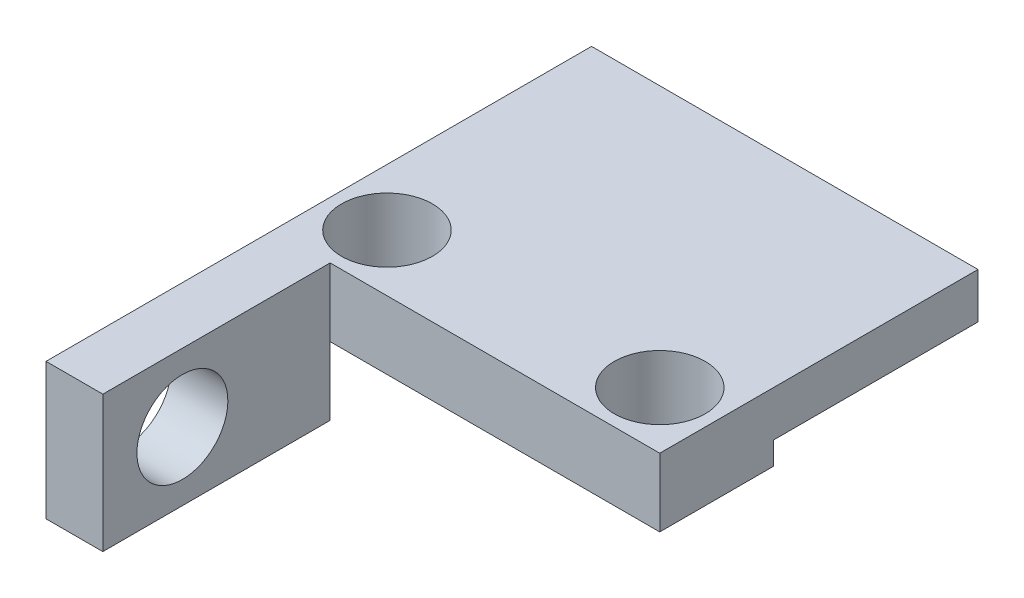
ISO-10303-21;
HEADER;
FILE_DESCRIPTION(('STEP AP214'),'2;1');
FILE_NAME('part.step','',(''),(''),'','','');
FILE_SCHEMA(('AUTOMOTIVE_DESIGN { 1 0 10303 214 1 1 1 1 }'));
ENDSEC;
DATA;
#1=APPLICATION_CONTEXT('core data for automotive mechanical design processes');
#2=APPLICATION_PROTOCOL_DEFINITION('international standard','automotive_design',2000,#1);
#3=PRODUCT_CONTEXT('',#1,'mechanical');
#4=PRODUCT('Part','Part','',(#3));
#5=PRODUCT_RELATED_PRODUCT_CATEGORY('part','',(#4));
#6=PRODUCT_DEFINITION_FORMATION('','',#4);
#7=PRODUCT_DEFINITION_CONTEXT('part definition',#1,'design');
#8=PRODUCT_DEFINITION('design','',#6,#7);
#9=PRODUCT_DEFINITION_SHAPE('','',#8);
#10=(LENGTH_UNIT() NAMED_UNIT(*) SI_UNIT(.MILLI.,.METRE.));
#11=(NAMED_UNIT(*) PLANE_ANGLE_UNIT() SI_UNIT($,.RADIAN.));
#12=(NAMED_UNIT(*) SI_UNIT($,.STERADIAN.) SOLID_ANGLE_UNIT());
#13=UNCERTAINTY_MEASURE_WITH_UNIT(LENGTH_MEASURE(1.E-05),#10,'distance_accuracy_value','');
#14=(GEOMETRIC_REPRESENTATION_CONTEXT(3) GLOBAL_UNCERTAINTY_ASSIGNED_CONTEXT((#13)) GLOBAL_UNIT_ASSIGNED_CONTEXT((#10,
#11,#12)) REPRESENTATION_CONTEXT('',''));
#15=CARTESIAN_POINT('',(0.,0.,0.));
#16=DIRECTION('',(0.,0.,1.));
#17=DIRECTION('',(1.,0.,0.));
#18=AXIS2_PLACEMENT_3D('',#15,#16,#17);
#19=CARTESIAN_POINT('',(19.9712230215827,6.,4.17266187050359));
#20=DIRECTION('',(0.,0.,-1.));
#21=DIRECTION('',(-1.,0.,0.));
#22=AXIS2_PLACEMENT_3D('',#19,#20,#21);
#23=PLANE('',#22);
#24=DIRECTION('',(0.,1.,0.));
#25=VECTOR('',#24,1.);
#26=CARTESIAN_POINT('',(-9.02877697841725,6.,4.1726618705036));
#27=LINE('',#26,#25);
#28=CARTESIAN_POINT('',(-9.02877697841725,0.,4.1726618705036));
#29=VERTEX_POINT('',#28);
#30=CARTESIAN_POINT('',(-9.02877697841725,6.,4.1726618705036));
#31=VERTEX_POINT('',#30);
#32=EDGE_CURVE('E11',#29,#31,#27,.T.);
#33=ORIENTED_EDGE('',*,*,#32,.F.);
#34=DIRECTION('',(1.,0.,0.));
#35=VECTOR('',#34,1.);
#36=CARTESIAN_POINT('',(19.9712230215827,0.,4.17266187050359));
#37=LINE('',#36,#35);
#38=CARTESIAN_POINT('',(19.9712230215827,0.,4.17266187050359));
#39=VERTEX_POINT('',#38);
#40=EDGE_CURVE('E177',#29,#39,#37,.T.);
#41=ORIENTED_EDGE('',*,*,#40,.T.);
#42=DIRECTION('',(0.,-1.,0.));
#43=VECTOR('',#42,1.);
#44=CARTESIAN_POINT('',(19.9712230215827,6.,4.17266187050359));
#45=LINE('',#44,#43);
#46=CARTESIAN_POINT('',(19.9712230215827,6.,4.17266187050359));
#47=VERTEX_POINT('',#46);
#48=EDGE_CURVE('E195',#47,#39,#45,.T.);
#49=ORIENTED_EDGE('',*,*,#48,.F.);
#50=DIRECTION('',(1.,0.,0.));
#51=VECTOR('',#50,1.);
#52=CARTESIAN_POINT('',(19.9712230215827,6.,4.17266187050359));
#53=LINE('',#52,#51);
#54=EDGE_CURVE('E178',#31,#47,#53,.T.);
#55=ORIENTED_EDGE('',*,*,#54,.F.);
#56=EDGE_LOOP('',(#33,#41,#49,#55));
#57=FACE_BOUND('',#56,.T.);
#58=ADVANCED_FACE('F35',(#57),#23,.F.);
#59=CARTESIAN_POINT('',(19.9712230215827,6.,-23.8273381294964));
#60=DIRECTION('',(-1.,0.,0.));
#61=DIRECTION('',(0.,0.,1.));
#62=AXIS2_PLACEMENT_3D('',#59,#60,#61);
#63=PLANE('',#62);
#64=DIRECTION('',(0.,0.,1.));
#65=VECTOR('',#64,1.);
#66=CARTESIAN_POINT('',(19.9712230215827,2.,-23.8273381294964));
#67=LINE('',#66,#65);
#68=CARTESIAN_POINT('',(19.9712230215827,2.,-23.8273381294964));
#69=VERTEX_POINT('',#68);
#70=CARTESIAN_POINT('',(19.9712230215827,2.,-5.8273381294964));
#71=VERTEX_POINT('',#70);
#72=EDGE_CURVE('E175',#69,#71,#67,.T.);
#73=ORIENTED_EDGE('',*,*,#72,.F.);
#74=DIRECTION('',(0.,-1.,0.));
#75=VECTOR('',#74,1.);
#76=CARTESIAN_POINT('',(19.9712230215827,6.,-23.8273381294964));
#77=LINE('',#76,#75);
#78=CARTESIAN_POINT('',(19.9712230215827,6.,-23.8273381294964));
#79=VERTEX_POINT('',#78);
#80=EDGE_CURVE('E192',#79,#69,#77,.T.);
#81=ORIENTED_EDGE('',*,*,#80,.F.);
#82=DIRECTION('',(0.,0.,-1.));
#83=VECTOR('',#82,1.);
#84=CARTESIAN_POINT('',(19.9712230215827,6.,-23.8273381294964));
#85=LINE('',#84,#83);
#86=EDGE_CURVE('E180',#47,#79,#85,.T.);
#87=ORIENTED_EDGE('',*,*,#86,.F.);
#88=ORIENTED_EDGE('',*,*,#48,.T.);
#89=DIRECTION('',(0.,0.,-1.));
#90=VECTOR('',#89,1.);
#91=CARTESIAN_POINT('',(19.9712230215827,0.,-23.8273381294964));
#92=LINE('',#91,#90);
#93=CARTESIAN_POINT('',(19.9712230215827,0.,-5.82733812949641));
#94=VERTEX_POINT('',#93);
#95=EDGE_CURVE('E187',#39,#94,#92,.T.);
#96=ORIENTED_EDGE('',*,*,#95,.T.);
#97=DIRECTION('',(0.,-1.,0.));
#98=VECTOR('',#97,1.);
#99=CARTESIAN_POINT('',(19.9712230215827,6.00000000000001,-5.82733812949641));
#100=LINE('',#99,#98);
#101=EDGE_CURVE('E57',#71,#94,#100,.T.);
#102=ORIENTED_EDGE('',*,*,#101,.F.);
#103=EDGE_LOOP('',(#73,#81,#87,#88,#96,#102));
#104=FACE_BOUND('',#103,.T.);
#105=ADVANCED_FACE('F210',(#104),#63,.F.);
#106=CARTESIAN_POINT('',(-14.0287769784173,6.,-23.8273381294964));
#107=DIRECTION('',(0.,0.,1.));
#108=DIRECTION('',(1.,0.,0.));
#109=AXIS2_PLACEMENT_3D('',#106,#107,#108);
#110=PLANE('',#109);
#111=DIRECTION('',(-1.,0.,0.));
#112=VECTOR('',#111,1.);
#113=CARTESIAN_POINT('',(75.5364999488149,2.,-23.8273381294964));
#114=LINE('',#113,#112);
#115=CARTESIAN_POINT('',(-14.0287769784173,2.,-23.8273381294964));
#116=VERTEX_POINT('',#115);
#117=EDGE_CURVE('E169',#69,#116,#114,.T.);
#118=ORIENTED_EDGE('',*,*,#117,.T.);
#119=DIRECTION('',(0.,-1.,0.));
#120=VECTOR('',#119,1.);
#121=CARTESIAN_POINT('',(-14.0287769784173,6.,-23.8273381294964));
#122=LINE('',#121,#120);
#123=CARTESIAN_POINT('',(-14.0287769784173,6.,-23.8273381294964));
#124=VERTEX_POINT('',#123);
#125=EDGE_CURVE('E120',#124,#116,#122,.T.);
#126=ORIENTED_EDGE('',*,*,#125,.F.);
#127=DIRECTION('',(-1.,0.,0.));
#128=VECTOR('',#127,1.);
#129=CARTESIAN_POINT('',(-14.0287769784173,6.,-23.8273381294964));
#130=LINE('',#129,#128);
#131=EDGE_CURVE('E116',#79,#124,#130,.T.);
#132=ORIENTED_EDGE('',*,*,#131,.F.);
#133=ORIENTED_EDGE('',*,*,#80,.T.);
#134=EDGE_LOOP('',(#118,#126,#132,#133));
#135=FACE_BOUND('',#134,.T.);
#136=ADVANCED_FACE('F206',(#135),#110,.F.);
#137=CARTESIAN_POINT('',(-14.0287769784173,6.,4.1726618705036));
#138=DIRECTION('',(1.,0.,0.));
#139=DIRECTION('',(0.,0.,-1.));
#140=AXIS2_PLACEMENT_3D('',#137,#138,#139);
#141=PLANE('',#140);
#142=CARTESIAN_POINT('',(-14.0287769784173,0.,17.1726618705036));
#143=DIRECTION('',(1.,0.,0.));
#144=DIRECTION('',(0.,0.,-1.));
#145=AXIS2_PLACEMENT_3D('',#142,#143,#144);
#146=CIRCLE('',#145,4.);
#147=CARTESIAN_POINT('',(-14.0287769784173,0.,13.1726618705036));
#148=VERTEX_POINT('',#147);
#149=EDGE_CURVE('E140',#148,#148,#146,.F.);
#150=ORIENTED_EDGE('',*,*,#149,.F.);
#151=EDGE_LOOP('',(#150));
#152=FACE_BOUND('',#151,.T.);
#153=DIRECTION('',(0.,0.,-1.));
#154=VECTOR('',#153,1.);
#155=CARTESIAN_POINT('',(-14.0287769784173,2.,4.1726618705036));
#156=LINE('',#155,#154);
#157=CARTESIAN_POINT('',(-14.0287769784173,2.,-5.8273381294964));
#158=VERTEX_POINT('',#157);
#159=EDGE_CURVE('E38',#158,#116,#156,.T.);
#160=ORIENTED_EDGE('',*,*,#159,.F.);
#161=DIRECTION('',(0.,1.,0.));
#162=VECTOR('',#161,1.);
#163=CARTESIAN_POINT('',(-14.0287769784173,6.,-5.82733812949641));
#164=LINE('',#163,#162);
#165=CARTESIAN_POINT('',(-14.0287769784173,0.,-5.8273381294964));
#166=VERTEX_POINT('',#165);
#167=EDGE_CURVE('E172',#166,#158,#164,.T.);
#168=ORIENTED_EDGE('',*,*,#167,.F.);
#169=DIRECTION('',(0.,0.,1.));
#170=VECTOR('',#169,1.);
#171=CARTESIAN_POINT('',(-14.0287769784173,0.,4.1726618705036));
#172=LINE('',#171,#170);
#173=CARTESIAN_POINT('',(-14.0287769784173,0.,4.1726618705036));
#174=VERTEX_POINT('',#173);
#175=EDGE_CURVE('E181',#166,#174,#172,.T.);
#176=ORIENTED_EDGE('',*,*,#175,.T.);
#177=DIRECTION('',(0.,-1.,0.));
#178=VECTOR('',#177,1.);
#179=CARTESIAN_POINT('',(-14.0287769784173,-6.,4.1726618705036));
#180=LINE('',#179,#178);
#181=CARTESIAN_POINT('',(-14.0287769784173,-6.,4.1726618705036));
#182=VERTEX_POINT('',#181);
#183=EDGE_CURVE('E146',#174,#182,#180,.T.);
#184=ORIENTED_EDGE('',*,*,#183,.T.);
#185=DIRECTION('',(0.,0.,-1.));
#186=VECTOR('',#185,1.);
#187=CARTESIAN_POINT('',(-14.0287769784173,-6.,24.1726618705036));
#188=LINE('',#187,#186);
#189=CARTESIAN_POINT('',(-14.0287769784173,-6.,24.1726618705036));
#190=VERTEX_POINT('',#189);
#191=EDGE_CURVE('E127',#190,#182,#188,.T.);
#192=ORIENTED_EDGE('',*,*,#191,.F.);
#193=DIRECTION('',(0.,-1.,0.));
#194=VECTOR('',#193,1.);
#195=CARTESIAN_POINT('',(-14.0287769784173,-6.,24.1726618705036));
#196=LINE('',#195,#194);
#197=CARTESIAN_POINT('',(-14.0287769784173,6.,24.1726618705036));
#198=VERTEX_POINT('',#197);
#199=EDGE_CURVE('E123',#198,#190,#196,.T.);
#200=ORIENTED_EDGE('',*,*,#199,.F.);
#201=DIRECTION('',(0.,0.,1.));
#202=VECTOR('',#201,1.);
#203=CARTESIAN_POINT('',(-14.0287769784173,6.,4.1726618705036));
#204=LINE('',#203,#202);
#205=EDGE_CURVE('E109',#124,#198,#204,.T.);
#206=ORIENTED_EDGE('',*,*,#205,.F.);
#207=ORIENTED_EDGE('',*,*,#125,.T.);
#208=EDGE_LOOP('',(#160,#168,#176,#184,#192,#200,#206,#207));
#209=FACE_BOUND('',#208,.T.);
#210=ADVANCED_FACE('F125',(#152,#209),#141,.F.);
#211=CARTESIAN_POINT('',(0.,0.,0.));
#212=DIRECTION('',(0.,-1.,0.));
#213=DIRECTION('',(0.,0.,-1.));
#214=AXIS2_PLACEMENT_3D('',#211,#212,#213);
#215=PLANE('',#214);
#216=CARTESIAN_POINT('',(14.9712230215827,0.,-0.827338129496403));
#217=DIRECTION('',(0.,-1.,0.));
#218=DIRECTION('',(0.,0.,-1.));
#219=AXIS2_PLACEMENT_3D('',#216,#217,#218);
#220=CIRCLE('',#219,4.);
#221=CARTESIAN_POINT('',(14.9712230215827,0.,-4.8273381294964));
#222=VERTEX_POINT('',#221);
#223=EDGE_CURVE('E154',#222,#222,#220,.T.);
#224=ORIENTED_EDGE('',*,*,#223,.F.);
#225=EDGE_LOOP('',(#224));
#226=FACE_BOUND('',#225,.T.);
#227=CARTESIAN_POINT('',(-9.02877697841725,0.,-0.827338129496405));
#228=DIRECTION('',(0.,-1.,0.));
#229=DIRECTION('',(0.,0.,-1.));
#230=AXIS2_PLACEMENT_3D('',#227,#228,#229);
#231=CIRCLE('',#230,4.);
#232=CARTESIAN_POINT('',(-9.02877697841725,0.,-4.82733812949641));
#233=VERTEX_POINT('',#232);
#234=EDGE_CURVE('E160',#233,#233,#231,.T.);
#235=ORIENTED_EDGE('',*,*,#234,.F.);
#236=EDGE_LOOP('',(#235));
#237=FACE_BOUND('',#236,.T.);
#238=ORIENTED_EDGE('',*,*,#175,.F.);
#239=DIRECTION('',(1.,0.,0.));
#240=VECTOR('',#239,1.);
#241=CARTESIAN_POINT('',(0.,0.,-5.8273381294964));
#242=LINE('',#241,#240);
#243=EDGE_CURVE('E197',#166,#94,#242,.T.);
#244=ORIENTED_EDGE('',*,*,#243,.T.);
#245=ORIENTED_EDGE('',*,*,#95,.F.);
#246=ORIENTED_EDGE('',*,*,#40,.F.);
#247=EDGE_CURVE('E184',#174,#29,#37,.T.);
#248=ORIENTED_EDGE('',*,*,#247,.F.);
#249=EDGE_LOOP('',(#238,#244,#245,#246,#248));
#250=FACE_BOUND('',#249,.T.);
#251=ADVANCED_FACE('F214',(#226,#237,#250),#215,.T.);
#252=CARTESIAN_POINT('',(0.,6.,0.));
#253=DIRECTION('',(0.,-1.,0.));
#254=DIRECTION('',(0.,0.,-1.));
#255=AXIS2_PLACEMENT_3D('',#252,#253,#254);
#256=PLANE('',#255);
#257=CARTESIAN_POINT('',(14.9712230215827,6.,-0.827338129496403));
#258=DIRECTION('',(0.,-1.,0.));
#259=DIRECTION('',(0.,0.,-1.));
#260=AXIS2_PLACEMENT_3D('',#257,#258,#259);
#261=CIRCLE('',#260,4.);
#262=CARTESIAN_POINT('',(14.9712230215827,6.,-4.8273381294964));
#263=VERTEX_POINT('',#262);
#264=EDGE_CURVE('E157',#263,#263,#261,.F.);
#265=ORIENTED_EDGE('',*,*,#264,.F.);
#266=EDGE_LOOP('',(#265));
#267=FACE_BOUND('',#266,.T.);
#268=CARTESIAN_POINT('',(-9.02877697841725,6.,-0.827338129496405));
#269=DIRECTION('',(0.,-1.,0.));
#270=DIRECTION('',(0.,0.,-1.));
#271=AXIS2_PLACEMENT_3D('',#268,#269,#270);
#272=CIRCLE('',#271,4.);
#273=CARTESIAN_POINT('',(-9.02877697841725,6.,-4.82733812949641));
#274=VERTEX_POINT('',#273);
#275=EDGE_CURVE('E163',#274,#274,#272,.F.);
#276=ORIENTED_EDGE('',*,*,#275,.F.);
#277=EDGE_LOOP('',(#276));
#278=FACE_BOUND('',#277,.T.);
#279=ORIENTED_EDGE('',*,*,#205,.T.);
#280=DIRECTION('',(-1.,0.,0.));
#281=VECTOR('',#280,1.);
#282=CARTESIAN_POINT('',(-14.0287769784173,6.,24.1726618705036));
#283=LINE('',#282,#281);
#284=CARTESIAN_POINT('',(-9.02877697841725,6.,24.1726618705036));
#285=VERTEX_POINT('',#284);
#286=EDGE_CURVE('E114',#285,#198,#283,.T.);
#287=ORIENTED_EDGE('',*,*,#286,.F.);
#288=DIRECTION('',(0.,0.,-1.));
#289=VECTOR('',#288,1.);
#290=CARTESIAN_POINT('',(-9.02877697841725,6.,24.1726618705036));
#291=LINE('',#290,#289);
#292=EDGE_CURVE('E145',#285,#31,#291,.T.);
#293=ORIENTED_EDGE('',*,*,#292,.T.);
#294=ORIENTED_EDGE('',*,*,#54,.T.);
#295=ORIENTED_EDGE('',*,*,#86,.T.);
#296=ORIENTED_EDGE('',*,*,#131,.T.);
#297=EDGE_LOOP('',(#279,#287,#293,#294,#295,#296));
#298=FACE_BOUND('',#297,.T.);
#299=ADVANCED_FACE('F111',(#267,#278,#298),#256,.F.);
#300=CARTESIAN_POINT('',(75.5364999488149,2.,-23.8273381294964));
#301=DIRECTION('',(0.,-1.,0.));
#302=DIRECTION('',(0.,0.,-1.));
#303=AXIS2_PLACEMENT_3D('',#300,#301,#302);
#304=PLANE('',#303);
#305=ORIENTED_EDGE('',*,*,#117,.F.);
#306=ORIENTED_EDGE('',*,*,#72,.T.);
#307=DIRECTION('',(-1.,0.,0.));
#308=VECTOR('',#307,1.);
#309=CARTESIAN_POINT('',(75.5364999488149,2.,-5.8273381294964));
#310=LINE('',#309,#308);
#311=EDGE_CURVE('E166',#71,#158,#310,.T.);
#312=ORIENTED_EDGE('',*,*,#311,.T.);
#313=ORIENTED_EDGE('',*,*,#159,.T.);
#314=EDGE_LOOP('',(#305,#306,#312,#313));
#315=FACE_BOUND('',#314,.T.);
#316=ADVANCED_FACE('F202',(#315),#304,.T.);
#317=CARTESIAN_POINT('',(75.5364999488149,2.,-5.8273381294964));
#318=DIRECTION('',(0.,0.,-1.));
#319=DIRECTION('',(0.,1.,0.));
#320=AXIS2_PLACEMENT_3D('',#317,#318,#319);
#321=PLANE('',#320);
#322=ORIENTED_EDGE('',*,*,#311,.F.);
#323=ORIENTED_EDGE('',*,*,#101,.T.);
#324=ORIENTED_EDGE('',*,*,#243,.F.);
#325=ORIENTED_EDGE('',*,*,#167,.T.);
#326=EDGE_LOOP('',(#322,#323,#324,#325));
#327=FACE_BOUND('',#326,.T.);
#328=ADVANCED_FACE('F212',(#327),#321,.T.);
#329=CARTESIAN_POINT('',(-9.02877697841725,6.001,-0.827338129496405));
#330=DIRECTION('',(0.,-1.,0.));
#331=DIRECTION('',(0.,0.,-1.));
#332=AXIS2_PLACEMENT_3D('',#329,#330,#331);
#333=CYLINDRICAL_SURFACE('',#332,4.);
#334=CARTESIAN_POINT('',(-9.02877697841725,0.,-4.82733812949641));
#335=CARTESIAN_POINT('',(-9.02877697841725,0.0625000000000001,-4.82733812949641));
#336=CARTESIAN_POINT('',(-9.02877697841725,0.125,-4.82733812949641));
#337=CARTESIAN_POINT('',(-9.02877697841725,0.25,-4.82733812949641));
#338=CARTESIAN_POINT('',(-9.02877697841725,0.3125,-4.82733812949641));
#339=CARTESIAN_POINT('',(-9.02877697841725,0.4375,-4.82733812949641));
#340=CARTESIAN_POINT('',(-9.02877697841725,0.5,-4.82733812949641));
#341=CARTESIAN_POINT('',(-9.02877697841725,0.625000000000001,-4.82733812949641));
#342=CARTESIAN_POINT('',(-9.02877697841725,0.687500000000001,-4.82733812949641));
#343=CARTESIAN_POINT('',(-9.02877697841725,0.8125,-4.82733812949641));
#344=CARTESIAN_POINT('',(-9.02877697841725,0.875,-4.82733812949641));
#345=CARTESIAN_POINT('',(-9.02877697841725,1.,-4.82733812949641));
#346=CARTESIAN_POINT('',(-9.02877697841725,1.0625,-4.82733812949641));
#347=CARTESIAN_POINT('',(-9.02877697841725,1.1875,-4.82733812949641));
#348=CARTESIAN_POINT('',(-9.02877697841725,1.25,-4.82733812949641));
#349=CARTESIAN_POINT('',(-9.02877697841725,1.375,-4.82733812949641));
#350=CARTESIAN_POINT('',(-9.02877697841725,1.4375,-4.82733812949641));
#351=CARTESIAN_POINT('',(-9.02877697841725,1.5625,-4.82733812949641));
#352=CARTESIAN_POINT('',(-9.02877697841725,1.625,-4.82733812949641));
#353=CARTESIAN_POINT('',(-9.02877697841725,1.75,-4.82733812949641));
#354=CARTESIAN_POINT('',(-9.02877697841725,1.8125,-4.82733812949641));
#355=CARTESIAN_POINT('',(-9.02877697841725,1.9375,-4.82733812949641));
#356=CARTESIAN_POINT('',(-9.02877697841725,2.,-4.82733812949641));
#357=CARTESIAN_POINT('',(-9.02877697841725,2.125,-4.82733812949641));
#358=CARTESIAN_POINT('',(-9.02877697841725,2.1875,-4.82733812949641));
#359=CARTESIAN_POINT('',(-9.02877697841725,2.3125,-4.82733812949641));
#360=CARTESIAN_POINT('',(-9.02877697841725,2.375,-4.82733812949641));
#361=CARTESIAN_POINT('',(-9.02877697841725,2.5,-4.82733812949641));
#362=CARTESIAN_POINT('',(-9.02877697841725,2.5625,-4.82733812949641));
#363=CARTESIAN_POINT('',(-9.02877697841725,2.6875,-4.82733812949641));
#364=CARTESIAN_POINT('',(-9.02877697841725,2.75,-4.82733812949641));
#365=CARTESIAN_POINT('',(-9.02877697841725,2.875,-4.82733812949641));
#366=CARTESIAN_POINT('',(-9.02877697841725,2.9375,-4.82733812949641));
#367=CARTESIAN_POINT('',(-9.02877697841725,3.0625,-4.82733812949641));
#368=CARTESIAN_POINT('',(-9.02877697841725,3.125,-4.82733812949641));
#369=CARTESIAN_POINT('',(-9.02877697841725,3.25,-4.82733812949641));
#370=CARTESIAN_POINT('',(-9.02877697841725,3.3125,-4.82733812949641));
#371=CARTESIAN_POINT('',(-9.02877697841725,3.4375,-4.82733812949641));
#372=CARTESIAN_POINT('',(-9.02877697841725,3.5,-4.82733812949641));
#373=CARTESIAN_POINT('',(-9.02877697841725,3.625,-4.82733812949641));
#374=CARTESIAN_POINT('',(-9.02877697841725,3.6875,-4.82733812949641));
#375=CARTESIAN_POINT('',(-9.02877697841725,3.8125,-4.82733812949641));
#376=CARTESIAN_POINT('',(-9.02877697841725,3.875,-4.82733812949641));
#377=CARTESIAN_POINT('',(-9.02877697841725,4.,-4.82733812949641));
#378=CARTESIAN_POINT('',(-9.02877697841725,4.0625,-4.82733812949641));
#379=CARTESIAN_POINT('',(-9.02877697841725,4.1875,-4.82733812949641));
#380=CARTESIAN_POINT('',(-9.02877697841725,4.25,-4.82733812949641));
#381=CARTESIAN_POINT('',(-9.02877697841725,4.375,-4.82733812949641));
#382=CARTESIAN_POINT('',(-9.02877697841725,4.4375,-4.82733812949641));
#383=CARTESIAN_POINT('',(-9.02877697841725,4.5625,-4.82733812949641));
#384=CARTESIAN_POINT('',(-9.02877697841725,4.625,-4.82733812949641));
#385=CARTESIAN_POINT('',(-9.02877697841725,4.75,-4.82733812949641));
#386=CARTESIAN_POINT('',(-9.02877697841725,4.8125,-4.82733812949641));
#387=CARTESIAN_POINT('',(-9.02877697841725,4.9375,-4.82733812949641));
#388=CARTESIAN_POINT('',(-9.02877697841725,5.,-4.82733812949641));
#389=CARTESIAN_POINT('',(-9.02877697841725,5.125,-4.82733812949641));
#390=CARTESIAN_POINT('',(-9.02877697841725,5.1875,-4.82733812949641));
#391=CARTESIAN_POINT('',(-9.02877697841725,5.3125,-4.82733812949641));
#392=CARTESIAN_POINT('',(-9.02877697841725,5.375,-4.82733812949641));
#393=CARTESIAN_POINT('',(-9.02877697841725,5.5,-4.82733812949641));
#394=CARTESIAN_POINT('',(-9.02877697841725,5.5625,-4.82733812949641));
#395=CARTESIAN_POINT('',(-9.02877697841725,5.6875,-4.82733812949641));
#396=CARTESIAN_POINT('',(-9.02877697841725,5.75,-4.82733812949641));
#397=CARTESIAN_POINT('',(-9.02877697841725,5.875,-4.82733812949641));
#398=CARTESIAN_POINT('',(-9.02877697841725,5.9375,-4.82733812949641));
#399=CARTESIAN_POINT('',(-9.02877697841725,6.,-4.82733812949641));
#400=B_SPLINE_CURVE_WITH_KNOTS('',3,(#334,#335,#336,#337,#338,#339,#340,#341,#342,#343,#344,
#345,#346,#347,#348,#349,#350,#351,#352,#353,#354,#355,#356,#357,#358,#359,#360,#361,#362,#363,
#364,#365,#366,#367,#368,#369,#370,#371,#372,#373,#374,#375,#376,#377,#378,#379,#380,#381,#382,
#383,#384,#385,#386,#387,#388,#389,#390,#391,#392,#393,#394,#395,#396,#397,#398,#399),
.UNSPECIFIED.,.F.,.F.,(4,2,2,2,2,2,2,2,2,2,2,2,2,2,2,2,2,2,2,2,2,2,2,2,2,2,2,2,2,2,2,2,4),(0.,
0.1875,0.375,0.5625,0.750000000000001,0.9375,1.125,1.3125,1.5,1.6875,1.875,2.0625,2.25,2.4375,
2.625,2.8125,3.,3.1875,3.375,3.5625,3.75,3.9375,4.125,4.3125,4.5,4.6875,4.875,5.0625,5.25,
5.4375,5.625,5.8125,6.),.UNSPECIFIED.);
#401=EDGE_CURVE('BSEAM247',#233,#274,#400,.T.);
#402=ORIENTED_EDGE('',*,*,#234,.T.);
#403=ORIENTED_EDGE('',*,*,#275,.T.);
#404=ORIENTED_EDGE('',*,*,#401,.T.);
#405=ORIENTED_EDGE('',*,*,#401,.F.);
#406=EDGE_LOOP('',(#402,#404,#403,#405));
#407=FACE_BOUND('',#406,.T.);
#408=ADVANCED_FACE('F247',(#407),#333,.F.);
#409=CARTESIAN_POINT('',(14.9712230215827,6.001,-0.827338129496403));
#410=DIRECTION('',(0.,-1.,0.));
#411=DIRECTION('',(0.,0.,-1.));
#412=AXIS2_PLACEMENT_3D('',#409,#410,#411);
#413=CYLINDRICAL_SURFACE('',#412,4.);
#414=CARTESIAN_POINT('',(14.9712230215827,0.,-4.8273381294964));
#415=CARTESIAN_POINT('',(14.9712230215827,0.0625000000000001,-4.8273381294964));
#416=CARTESIAN_POINT('',(14.9712230215827,0.125,-4.8273381294964));
#417=CARTESIAN_POINT('',(14.9712230215827,0.25,-4.8273381294964));
#418=CARTESIAN_POINT('',(14.9712230215827,0.3125,-4.8273381294964));
#419=CARTESIAN_POINT('',(14.9712230215827,0.4375,-4.8273381294964));
#420=CARTESIAN_POINT('',(14.9712230215827,0.5,-4.8273381294964));
#421=CARTESIAN_POINT('',(14.9712230215827,0.625000000000001,-4.8273381294964));
#422=CARTESIAN_POINT('',(14.9712230215827,0.687500000000001,-4.8273381294964));
#423=CARTESIAN_POINT('',(14.9712230215827,0.8125,-4.8273381294964));
#424=CARTESIAN_POINT('',(14.9712230215827,0.875,-4.8273381294964));
#425=CARTESIAN_POINT('',(14.9712230215827,1.,-4.8273381294964));
#426=CARTESIAN_POINT('',(14.9712230215827,1.0625,-4.8273381294964));
#427=CARTESIAN_POINT('',(14.9712230215827,1.1875,-4.8273381294964));
#428=CARTESIAN_POINT('',(14.9712230215827,1.25,-4.8273381294964));
#429=CARTESIAN_POINT('',(14.9712230215827,1.375,-4.8273381294964));
#430=CARTESIAN_POINT('',(14.9712230215827,1.4375,-4.8273381294964));
#431=CARTESIAN_POINT('',(14.9712230215827,1.5625,-4.8273381294964));
#432=CARTESIAN_POINT('',(14.9712230215827,1.625,-4.8273381294964));
#433=CARTESIAN_POINT('',(14.9712230215827,1.75,-4.8273381294964));
#434=CARTESIAN_POINT('',(14.9712230215827,1.8125,-4.8273381294964));
#435=CARTESIAN_POINT('',(14.9712230215827,1.9375,-4.8273381294964));
#436=CARTESIAN_POINT('',(14.9712230215827,2.,-4.8273381294964));
#437=CARTESIAN_POINT('',(14.9712230215827,2.125,-4.8273381294964));
#438=CARTESIAN_POINT('',(14.9712230215827,2.1875,-4.8273381294964));
#439=CARTESIAN_POINT('',(14.9712230215827,2.3125,-4.8273381294964));
#440=CARTESIAN_POINT('',(14.9712230215827,2.375,-4.8273381294964));
#441=CARTESIAN_POINT('',(14.9712230215827,2.5,-4.8273381294964));
#442=CARTESIAN_POINT('',(14.9712230215827,2.5625,-4.8273381294964));
#443=CARTESIAN_POINT('',(14.9712230215827,2.6875,-4.8273381294964));
#444=CARTESIAN_POINT('',(14.9712230215827,2.75,-4.8273381294964));
#445=CARTESIAN_POINT('',(14.9712230215827,2.875,-4.8273381294964));
#446=CARTESIAN_POINT('',(14.9712230215827,2.9375,-4.8273381294964));
#447=CARTESIAN_POINT('',(14.9712230215827,3.0625,-4.8273381294964));
#448=CARTESIAN_POINT('',(14.9712230215827,3.125,-4.8273381294964));
#449=CARTESIAN_POINT('',(14.9712230215827,3.25,-4.8273381294964));
#450=CARTESIAN_POINT('',(14.9712230215827,3.3125,-4.8273381294964));
#451=CARTESIAN_POINT('',(14.9712230215827,3.4375,-4.8273381294964));
#452=CARTESIAN_POINT('',(14.9712230215827,3.5,-4.8273381294964));
#453=CARTESIAN_POINT('',(14.9712230215827,3.625,-4.8273381294964));
#454=CARTESIAN_POINT('',(14.9712230215827,3.6875,-4.8273381294964));
#455=CARTESIAN_POINT('',(14.9712230215827,3.8125,-4.8273381294964));
#456=CARTESIAN_POINT('',(14.9712230215827,3.875,-4.8273381294964));
#457=CARTESIAN_POINT('',(14.9712230215827,4.,-4.8273381294964));
#458=CARTESIAN_POINT('',(14.9712230215827,4.0625,-4.8273381294964));
#459=CARTESIAN_POINT('',(14.9712230215827,4.1875,-4.8273381294964));
#460=CARTESIAN_POINT('',(14.9712230215827,4.25,-4.8273381294964));
#461=CARTESIAN_POINT('',(14.9712230215827,4.375,-4.8273381294964));
#462=CARTESIAN_POINT('',(14.9712230215827,4.4375,-4.8273381294964));
#463=CARTESIAN_POINT('',(14.9712230215827,4.5625,-4.8273381294964));
#464=CARTESIAN_POINT('',(14.9712230215827,4.625,-4.8273381294964));
#465=CARTESIAN_POINT('',(14.9712230215827,4.75,-4.8273381294964));
#466=CARTESIAN_POINT('',(14.9712230215827,4.8125,-4.8273381294964));
#467=CARTESIAN_POINT('',(14.9712230215827,4.9375,-4.8273381294964));
#468=CARTESIAN_POINT('',(14.9712230215827,5.,-4.8273381294964));
#469=CARTESIAN_POINT('',(14.9712230215827,5.125,-4.8273381294964));
#470=CARTESIAN_POINT('',(14.9712230215827,5.1875,-4.8273381294964));
#471=CARTESIAN_POINT('',(14.9712230215827,5.3125,-4.8273381294964));
#472=CARTESIAN_POINT('',(14.9712230215827,5.375,-4.8273381294964));
#473=CARTESIAN_POINT('',(14.9712230215827,5.5,-4.8273381294964));
#474=CARTESIAN_POINT('',(14.9712230215827,5.5625,-4.8273381294964));
#475=CARTESIAN_POINT('',(14.9712230215827,5.6875,-4.8273381294964));
#476=CARTESIAN_POINT('',(14.9712230215827,5.75,-4.8273381294964));
#477=CARTESIAN_POINT('',(14.9712230215827,5.875,-4.8273381294964));
#478=CARTESIAN_POINT('',(14.9712230215827,5.9375,-4.8273381294964));
#479=CARTESIAN_POINT('',(14.9712230215827,6.,-4.8273381294964));
#480=B_SPLINE_CURVE_WITH_KNOTS('',3,(#414,#415,#416,#417,#418,#419,#420,#421,#422,#423,#424,
#425,#426,#427,#428,#429,#430,#431,#432,#433,#434,#435,#436,#437,#438,#439,#440,#441,#442,#443,
#444,#445,#446,#447,#448,#449,#450,#451,#452,#453,#454,#455,#456,#457,#458,#459,#460,#461,#462,
#463,#464,#465,#466,#467,#468,#469,#470,#471,#472,#473,#474,#475,#476,#477,#478,#479),
.UNSPECIFIED.,.F.,.F.,(4,2,2,2,2,2,2,2,2,2,2,2,2,2,2,2,2,2,2,2,2,2,2,2,2,2,2,2,2,2,2,2,4),(0.,
0.1875,0.375,0.5625,0.750000000000001,0.9375,1.125,1.3125,1.5,1.6875,1.875,2.0625,2.25,2.4375,
2.625,2.8125,3.,3.1875,3.375,3.5625,3.75,3.9375,4.125,4.3125,4.5,4.6875,4.875,5.0625,5.25,
5.4375,5.625,5.8125,6.),.UNSPECIFIED.);
#481=EDGE_CURVE('BSEAM250',#222,#263,#480,.T.);
#482=ORIENTED_EDGE('',*,*,#223,.T.);
#483=ORIENTED_EDGE('',*,*,#264,.T.);
#484=ORIENTED_EDGE('',*,*,#481,.T.);
#485=ORIENTED_EDGE('',*,*,#481,.F.);
#486=EDGE_LOOP('',(#482,#484,#483,#485));
#487=FACE_BOUND('',#486,.T.);
#488=ADVANCED_FACE('F250',(#487),#413,.F.);
#489=CARTESIAN_POINT('',(-9.02877697841725,-6.,24.1726618705036));
#490=DIRECTION('',(0.,1.,0.));
#491=DIRECTION('',(-1.,0.,0.));
#492=AXIS2_PLACEMENT_3D('',#489,#490,#491);
#493=PLANE('',#492);
#494=DIRECTION('',(1.,0.,0.));
#495=VECTOR('',#494,1.);
#496=CARTESIAN_POINT('',(-9.02877697841725,-6.,4.1726618705036));
#497=LINE('',#496,#495);
#498=CARTESIAN_POINT('',(-9.02877697841725,-6.,4.1726618705036));
#499=VERTEX_POINT('',#498);
#500=EDGE_CURVE('E138',#182,#499,#497,.T.);
#501=ORIENTED_EDGE('',*,*,#500,.T.);
#502=DIRECTION('',(0.,0.,-1.));
#503=VECTOR('',#502,1.);
#504=CARTESIAN_POINT('',(-9.02877697841725,-6.,24.1726618705036));
#505=LINE('',#504,#503);
#506=CARTESIAN_POINT('',(-9.02877697841725,-6.,24.1726618705036));
#507=VERTEX_POINT('',#506);
#508=EDGE_CURVE('E150',#507,#499,#505,.T.);
#509=ORIENTED_EDGE('',*,*,#508,.F.);
#510=DIRECTION('',(1.,0.,0.));
#511=VECTOR('',#510,1.);
#512=CARTESIAN_POINT('',(-9.02877697841725,-6.,24.1726618705036));
#513=LINE('',#512,#511);
#514=EDGE_CURVE('E130',#190,#507,#513,.T.);
#515=ORIENTED_EDGE('',*,*,#514,.F.);
#516=ORIENTED_EDGE('',*,*,#191,.T.);
#517=EDGE_LOOP('',(#501,#509,#515,#516));
#518=FACE_BOUND('',#517,.T.);
#519=ADVANCED_FACE('F221',(#518),#493,.F.);
#520=CARTESIAN_POINT('',(-9.02877697841725,6.,24.1726618705036));
#521=DIRECTION('',(-1.,0.,0.));
#522=DIRECTION('',(0.,-1.,0.));
#523=AXIS2_PLACEMENT_3D('',#520,#521,#522);
#524=PLANE('',#523);
#525=CARTESIAN_POINT('',(-9.02877697841725,0.,17.1726618705036));
#526=DIRECTION('',(1.,0.,0.));
#527=DIRECTION('',(0.,1.,0.));
#528=AXIS2_PLACEMENT_3D('',#525,#526,#527);
#529=CIRCLE('',#528,4.);
#530=CARTESIAN_POINT('',(-9.02877697841725,4.,17.1726618705036));
#531=VERTEX_POINT('',#530);
#532=EDGE_CURVE('E272',#531,#531,#529,.T.);
#533=ORIENTED_EDGE('',*,*,#532,.F.);
#534=EDGE_LOOP('',(#533));
#535=FACE_BOUND('',#534,.T.);
#536=EDGE_CURVE('E44',#499,#29,#27,.T.);
#537=ORIENTED_EDGE('',*,*,#536,.T.);
#538=ORIENTED_EDGE('',*,*,#32,.T.);
#539=ORIENTED_EDGE('',*,*,#292,.F.);
#540=DIRECTION('',(0.,1.,0.));
#541=VECTOR('',#540,1.);
#542=CARTESIAN_POINT('',(-9.02877697841725,6.,24.1726618705036));
#543=LINE('',#542,#541);
#544=EDGE_CURVE('E134',#507,#285,#543,.T.);
#545=ORIENTED_EDGE('',*,*,#544,.F.);
#546=ORIENTED_EDGE('',*,*,#508,.T.);
#547=EDGE_LOOP('',(#537,#538,#539,#545,#546));
#548=FACE_BOUND('',#547,.T.);
#549=ADVANCED_FACE('F224',(#535,#548),#524,.F.);
#550=CARTESIAN_POINT('',(0.,0.,24.1726618705036));
#551=DIRECTION('',(0.,0.,-1.));
#552=DIRECTION('',(-1.,0.,0.));
#553=AXIS2_PLACEMENT_3D('',#550,#551,#552);
#554=PLANE('',#553);
#555=ORIENTED_EDGE('',*,*,#286,.T.);
#556=ORIENTED_EDGE('',*,*,#199,.T.);
#557=ORIENTED_EDGE('',*,*,#514,.T.);
#558=ORIENTED_EDGE('',*,*,#544,.T.);
#559=EDGE_LOOP('',(#555,#556,#557,#558));
#560=FACE_BOUND('',#559,.T.);
#561=ADVANCED_FACE('F132',(#560),#554,.F.);
#562=CARTESIAN_POINT('',(0.,0.,4.1726618705036));
#563=DIRECTION('',(0.,0.,-1.));
#564=DIRECTION('',(-1.,0.,0.));
#565=AXIS2_PLACEMENT_3D('',#562,#563,#564);
#566=PLANE('',#565);
#567=ORIENTED_EDGE('',*,*,#183,.F.);
#568=ORIENTED_EDGE('',*,*,#247,.T.);
#569=ORIENTED_EDGE('',*,*,#536,.F.);
#570=ORIENTED_EDGE('',*,*,#500,.F.);
#571=EDGE_LOOP('',(#567,#568,#569,#570));
#572=FACE_BOUND('',#571,.T.);
#573=ADVANCED_FACE('F219',(#572),#566,.T.);
#574=CARTESIAN_POINT('',(-14.0297769784173,0.,17.1726618705036));
#575=DIRECTION('',(1.,0.,0.));
#576=DIRECTION('',(0.,1.,0.));
#577=AXIS2_PLACEMENT_3D('',#574,#575,#576);
#578=CYLINDRICAL_SURFACE('',#577,4.);
#579=ORIENTED_EDGE('',*,*,#532,.T.);
#580=EDGE_LOOP('',(#579));
#581=FACE_BOUND('',#580,.T.);
#582=ORIENTED_EDGE('',*,*,#149,.T.);
#583=EDGE_LOOP('',(#582));
#584=FACE_BOUND('',#583,.T.);
#585=ADVANCED_FACE('F262',(#581,#584),#578,.F.);
#586=CLOSED_SHELL('',(#58,#105,#136,#210,#251,#299,#316,#328,#408,#488,#519,#549,#561,#573,#585));
#587=MANIFOLD_SOLID_BREP('B2',#586);
#588=ADVANCED_BREP_SHAPE_REPRESENTATION('',(#18,#587),#14);
#589=SHAPE_DEFINITION_REPRESENTATION(#9,#588);
ENDSEC;
END-ISO-10303-21;
